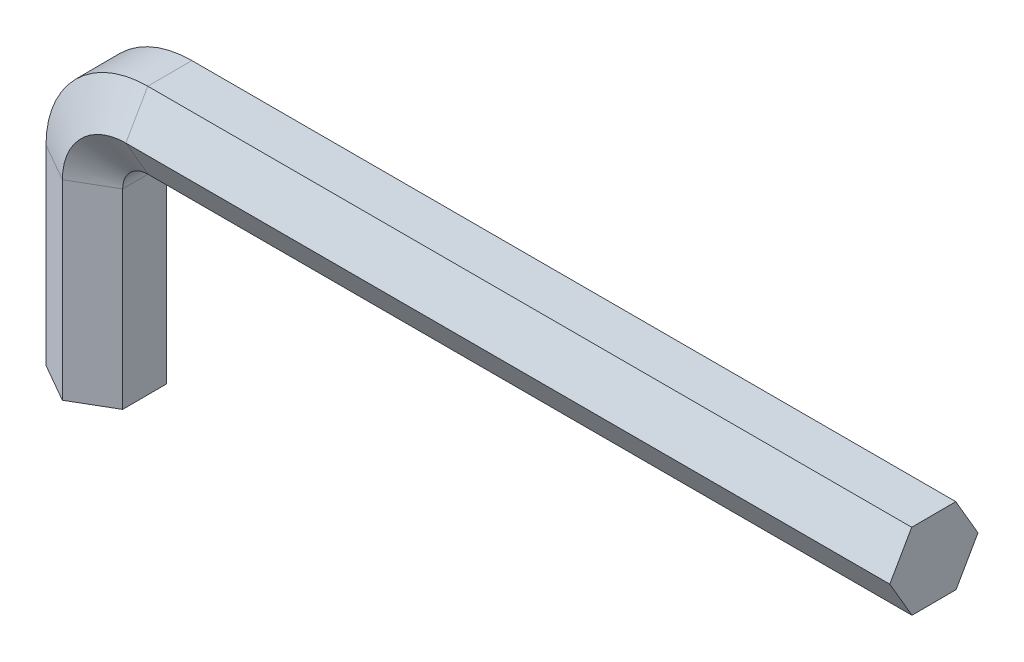
ISO-10303-21;
HEADER;
FILE_DESCRIPTION(('STEP AP214'),'2;1');
FILE_NAME('part.step','',(''),(''),'','','');
FILE_SCHEMA(('AUTOMOTIVE_DESIGN { 1 0 10303 214 1 1 1 1 }'));
ENDSEC;
DATA;
#1=APPLICATION_CONTEXT('core data for automotive mechanical design processes');
#2=APPLICATION_PROTOCOL_DEFINITION('international standard','automotive_design',2000,#1);
#3=PRODUCT_CONTEXT('',#1,'mechanical');
#4=PRODUCT('Part','Part','',(#3));
#5=PRODUCT_RELATED_PRODUCT_CATEGORY('part','',(#4));
#6=PRODUCT_DEFINITION_FORMATION('','',#4);
#7=PRODUCT_DEFINITION_CONTEXT('part definition',#1,'design');
#8=PRODUCT_DEFINITION('design','',#6,#7);
#9=PRODUCT_DEFINITION_SHAPE('','',#8);
#10=(LENGTH_UNIT() NAMED_UNIT(*) SI_UNIT(.MILLI.,.METRE.));
#11=(NAMED_UNIT(*) PLANE_ANGLE_UNIT() SI_UNIT($,.RADIAN.));
#12=(NAMED_UNIT(*) SI_UNIT($,.STERADIAN.) SOLID_ANGLE_UNIT());
#13=UNCERTAINTY_MEASURE_WITH_UNIT(LENGTH_MEASURE(1.E-05),#10,'distance_accuracy_value','');
#14=(GEOMETRIC_REPRESENTATION_CONTEXT(3) GLOBAL_UNCERTAINTY_ASSIGNED_CONTEXT((#13)) GLOBAL_UNIT_ASSIGNED_CONTEXT((#10,
#11,#12)) REPRESENTATION_CONTEXT('',''));
#15=CARTESIAN_POINT('',(0.,0.,0.));
#16=DIRECTION('',(0.,0.,1.));
#17=DIRECTION('',(1.,0.,0.));
#18=AXIS2_PLACEMENT_3D('',#15,#16,#17);
#19=CARTESIAN_POINT('',(0.,0.,0.));
#20=DIRECTION('',(-1.,0.,0.));
#21=DIRECTION('',(0.,-1.,0.));
#22=AXIS2_PLACEMENT_3D('',#19,#20,#21);
#23=PLANE('',#22);
#24=DIRECTION('',(0.,-0.00375398085830022,0.999992953789033));
#25=VECTOR('',#24,1.);
#26=CARTESIAN_POINT('',(0.,-2.99347677578988,-1.74330054574838));
#27=LINE('',#26,#25);
#28=CARTESIAN_POINT('',(0.,-2.99347677578988,-1.74330054574838));
#29=VERTEX_POINT('',#28);
#30=CARTESIAN_POINT('',(0.,-3.00648094694432,1.72077666059858));
#31=VERTEX_POINT('',#30);
#32=EDGE_CURVE('E187',#29,#31,#27,.T.);
#33=ORIENTED_EDGE('',*,*,#32,.F.);
#34=DIRECTION('',(0.,-0.867896292015891,0.496745434105908));
#35=VECTOR('',#34,1.);
#36=CARTESIAN_POINT('',(0.,0.0130041711544332,-3.46407720634696));
#37=LINE('',#36,#35);
#38=CARTESIAN_POINT('',(0.,0.0130041711544332,-3.46407720634696));
#39=VERTEX_POINT('',#38);
#40=EDGE_CURVE('E229',#39,#29,#37,.T.);
#41=ORIENTED_EDGE('',*,*,#40,.F.);
#42=DIRECTION('',(0.,-0.864142311157591,-0.503247519683125));
#43=VECTOR('',#42,1.);
#44=CARTESIAN_POINT('',(0.,3.00648094694432,-1.72077666059858));
#45=LINE('',#44,#43);
#46=CARTESIAN_POINT('',(0.,3.00648094694432,-1.72077666059858));
#47=VERTEX_POINT('',#46);
#48=EDGE_CURVE('E216',#47,#39,#45,.T.);
#49=ORIENTED_EDGE('',*,*,#48,.F.);
#50=DIRECTION('',(0.,0.00375398085829997,-0.999992953789033));
#51=VECTOR('',#50,1.);
#52=CARTESIAN_POINT('',(0.,2.99347677578988,1.74330054574838));
#53=LINE('',#52,#51);
#54=CARTESIAN_POINT('',(0.,2.99347677578988,1.74330054574838));
#55=VERTEX_POINT('',#54);
#56=EDGE_CURVE('E139',#55,#47,#53,.T.);
#57=ORIENTED_EDGE('',*,*,#56,.F.);
#58=DIRECTION('',(0.,0.867896292015891,-0.496745434105908));
#59=VECTOR('',#58,1.);
#60=CARTESIAN_POINT('',(0.,-0.0130041711544324,3.46407720634696));
#61=LINE('',#60,#59);
#62=CARTESIAN_POINT('',(0.,-0.0130041711544324,3.46407720634696));
#63=VERTEX_POINT('',#62);
#64=EDGE_CURVE('E143',#63,#55,#61,.T.);
#65=ORIENTED_EDGE('',*,*,#64,.F.);
#66=DIRECTION('',(0.,0.864142311157591,0.503247519683125));
#67=VECTOR('',#66,1.);
#68=CARTESIAN_POINT('',(0.,-3.00648094694432,1.72077666059858));
#69=LINE('',#68,#67);
#70=EDGE_CURVE('E148',#31,#63,#69,.T.);
#71=ORIENTED_EDGE('',*,*,#70,.F.);
#72=EDGE_LOOP('',(#33,#41,#49,#57,#65,#71));
#73=FACE_BOUND('',#72,.T.);
#74=ADVANCED_FACE('F38',(#73),#23,.F.);
#75=CARTESIAN_POINT('',(-65.,-20.,0.));
#76=DIRECTION('',(0.,-1.,0.));
#77=DIRECTION('',(1.,0.,0.));
#78=AXIS2_PLACEMENT_3D('',#75,#76,#77);
#79=PLANE('',#78);
#80=DIRECTION('',(0.00375398085830022,0.,0.999992953789033));
#81=VECTOR('',#80,1.);
#82=CARTESIAN_POINT('',(-62.0065232242101,-20.,-1.74330054574838));
#83=LINE('',#82,#81);
#84=CARTESIAN_POINT('',(-62.0065232242101,-20.,-1.74330054574838));
#85=VERTEX_POINT('',#84);
#86=CARTESIAN_POINT('',(-61.9935190530557,-20.,1.72077666059858));
#87=VERTEX_POINT('',#86);
#88=EDGE_CURVE('E159',#85,#87,#83,.T.);
#89=ORIENTED_EDGE('',*,*,#88,.T.);
#90=DIRECTION('',(-0.864142311157591,0.,0.503247519683125));
#91=VECTOR('',#90,1.);
#92=CARTESIAN_POINT('',(-61.9935190530557,-20.,1.72077666059858));
#93=LINE('',#92,#91);
#94=CARTESIAN_POINT('',(-64.9869958288456,-20.,3.46407720634696));
#95=VERTEX_POINT('',#94);
#96=EDGE_CURVE('E162',#87,#95,#93,.T.);
#97=ORIENTED_EDGE('',*,*,#96,.T.);
#98=DIRECTION('',(-0.867896292015891,0.,-0.496745434105908));
#99=VECTOR('',#98,1.);
#100=CARTESIAN_POINT('',(-64.9869958288456,-20.,3.46407720634696));
#101=LINE('',#100,#99);
#102=CARTESIAN_POINT('',(-67.9934767757899,-20.,1.74330054574838));
#103=VERTEX_POINT('',#102);
#104=EDGE_CURVE('E202',#95,#103,#101,.T.);
#105=ORIENTED_EDGE('',*,*,#104,.T.);
#106=DIRECTION('',(-0.00375398085829997,0.,-0.999992953789033));
#107=VECTOR('',#106,1.);
#108=CARTESIAN_POINT('',(-67.9934767757899,-20.,1.74330054574838));
#109=LINE('',#108,#107);
#110=CARTESIAN_POINT('',(-68.0064809469443,-20.,-1.72077666059858));
#111=VERTEX_POINT('',#110);
#112=EDGE_CURVE('E57',#103,#111,#109,.T.);
#113=ORIENTED_EDGE('',*,*,#112,.T.);
#114=DIRECTION('',(0.864142311157591,0.,-0.503247519683125));
#115=VECTOR('',#114,1.);
#116=CARTESIAN_POINT('',(-68.0064809469443,-20.,-1.72077666059858));
#117=LINE('',#116,#115);
#118=CARTESIAN_POINT('',(-65.0130041711544,-20.,-3.46407720634696));
#119=VERTEX_POINT('',#118);
#120=EDGE_CURVE('E51',#111,#119,#117,.T.);
#121=ORIENTED_EDGE('',*,*,#120,.T.);
#122=DIRECTION('',(0.867896292015891,0.,0.496745434105908));
#123=VECTOR('',#122,1.);
#124=CARTESIAN_POINT('',(-65.0130041711544,-20.,-3.46407720634696));
#125=LINE('',#124,#123);
#126=EDGE_CURVE('E11',#119,#85,#125,.T.);
#127=ORIENTED_EDGE('',*,*,#126,.T.);
#128=EDGE_LOOP('',(#89,#97,#105,#113,#121,#127));
#129=FACE_BOUND('',#128,.T.);
#130=ADVANCED_FACE('F161',(#129),#79,.T.);
#131=CARTESIAN_POINT('',(0.,-2.99347677578988,-1.74330054574838));
#132=DIRECTION('',(0.,-0.999992953789033,-0.00375398085830022));
#133=DIRECTION('',(0.,0.00375398085830022,-0.999992953789033));
#134=AXIS2_PLACEMENT_3D('',#131,#132,#133);
#135=PLANE('',#134);
#136=DIRECTION('',(-1.,0.,0.));
#137=VECTOR('',#136,1.);
#138=CARTESIAN_POINT('',(0.,-3.00648094694432,1.72077666059858));
#139=LINE('',#138,#137);
#140=CARTESIAN_POINT('',(-60.,-3.00648094694432,1.72077666059858));
#141=VERTEX_POINT('',#140);
#142=EDGE_CURVE('E192',#31,#141,#139,.T.);
#143=ORIENTED_EDGE('',*,*,#142,.T.);
#144=DIRECTION('',(0.,-0.00375398085830022,0.999992953789033));
#145=VECTOR('',#144,1.);
#146=CARTESIAN_POINT('',(-60.,-2.99347677578989,-1.74330054574838));
#147=LINE('',#146,#145);
#148=CARTESIAN_POINT('',(-60.,-2.99347677578989,-1.74330054574838));
#149=VERTEX_POINT('',#148);
#150=EDGE_CURVE('E261',#149,#141,#147,.T.);
#151=ORIENTED_EDGE('',*,*,#150,.F.);
#152=DIRECTION('',(-1.,0.,0.));
#153=VECTOR('',#152,1.);
#154=CARTESIAN_POINT('',(0.,-2.99347677578988,-1.74330054574838));
#155=LINE('',#154,#153);
#156=EDGE_CURVE('E243',#29,#149,#155,.T.);
#157=ORIENTED_EDGE('',*,*,#156,.F.);
#158=ORIENTED_EDGE('',*,*,#32,.T.);
#159=EDGE_LOOP('',(#143,#151,#157,#158));
#160=FACE_BOUND('',#159,.T.);
#161=ADVANCED_FACE('F268',(#160),#135,.T.);
#162=CARTESIAN_POINT('',(0.,-3.00648094694432,1.72077666059858));
#163=DIRECTION('',(0.,-0.503247519683125,0.864142311157591));
#164=DIRECTION('',(0.,-0.864142311157591,-0.503247519683125));
#165=AXIS2_PLACEMENT_3D('',#162,#163,#164);
#166=PLANE('',#165);
#167=DIRECTION('',(-1.,0.,0.));
#168=VECTOR('',#167,1.);
#169=CARTESIAN_POINT('',(0.,-0.0130041711544324,3.46407720634696));
#170=LINE('',#169,#168);
#171=CARTESIAN_POINT('',(-60.,-0.0130041711544398,3.46407720634696));
#172=VERTEX_POINT('',#171);
#173=EDGE_CURVE('E191',#63,#172,#170,.T.);
#174=ORIENTED_EDGE('',*,*,#173,.T.);
#175=DIRECTION('',(0.,0.864142311157591,0.503247519683125));
#176=VECTOR('',#175,1.);
#177=CARTESIAN_POINT('',(-60.,-3.00648094694432,1.72077666059858));
#178=LINE('',#177,#176);
#179=EDGE_CURVE('E188',#141,#172,#178,.T.);
#180=ORIENTED_EDGE('',*,*,#179,.F.);
#181=ORIENTED_EDGE('',*,*,#142,.F.);
#182=ORIENTED_EDGE('',*,*,#70,.T.);
#183=EDGE_LOOP('',(#174,#180,#181,#182));
#184=FACE_BOUND('',#183,.T.);
#185=ADVANCED_FACE('F271',(#184),#166,.T.);
#186=CARTESIAN_POINT('',(0.,-0.0130041711544324,3.46407720634696));
#187=DIRECTION('',(0.,0.496745434105908,0.867896292015891));
#188=DIRECTION('',(0.,-0.867896292015891,0.496745434105908));
#189=AXIS2_PLACEMENT_3D('',#186,#187,#188);
#190=PLANE('',#189);
#191=DIRECTION('',(-1.,0.,0.));
#192=VECTOR('',#191,1.);
#193=CARTESIAN_POINT('',(0.,2.99347677578988,1.74330054574838));
#194=LINE('',#193,#192);
#195=CARTESIAN_POINT('',(-60.,2.99347677578988,1.74330054574838));
#196=VERTEX_POINT('',#195);
#197=EDGE_CURVE('E205',#55,#196,#194,.T.);
#198=ORIENTED_EDGE('',*,*,#197,.T.);
#199=DIRECTION('',(0.,0.867896292015891,-0.496745434105908));
#200=VECTOR('',#199,1.);
#201=CARTESIAN_POINT('',(-60.,-0.0130041711544398,3.46407720634696));
#202=LINE('',#201,#200);
#203=EDGE_CURVE('E195',#172,#196,#202,.T.);
#204=ORIENTED_EDGE('',*,*,#203,.F.);
#205=ORIENTED_EDGE('',*,*,#173,.F.);
#206=ORIENTED_EDGE('',*,*,#64,.T.);
#207=EDGE_LOOP('',(#198,#204,#205,#206));
#208=FACE_BOUND('',#207,.T.);
#209=ADVANCED_FACE('F328',(#208),#190,.T.);
#210=CARTESIAN_POINT('',(0.,2.99347677578988,1.74330054574838));
#211=DIRECTION('',(0.,0.999992953789033,0.00375398085829997));
#212=DIRECTION('',(0.,-0.00375398085829997,0.999992953789033));
#213=AXIS2_PLACEMENT_3D('',#210,#211,#212);
#214=PLANE('',#213);
#215=DIRECTION('',(-1.,0.,0.));
#216=VECTOR('',#215,1.);
#217=CARTESIAN_POINT('',(0.,3.00648094694432,-1.72077666059858));
#218=LINE('',#217,#216);
#219=CARTESIAN_POINT('',(-60.,3.00648094694431,-1.72077666059858));
#220=VERTEX_POINT('',#219);
#221=EDGE_CURVE('E218',#47,#220,#218,.T.);
#222=ORIENTED_EDGE('',*,*,#221,.T.);
#223=DIRECTION('',(0.,0.00375398085829997,-0.999992953789033));
#224=VECTOR('',#223,1.);
#225=CARTESIAN_POINT('',(-60.,2.99347677578988,1.74330054574838));
#226=LINE('',#225,#224);
#227=EDGE_CURVE('E208',#196,#220,#226,.T.);
#228=ORIENTED_EDGE('',*,*,#227,.F.);
#229=ORIENTED_EDGE('',*,*,#197,.F.);
#230=ORIENTED_EDGE('',*,*,#56,.T.);
#231=EDGE_LOOP('',(#222,#228,#229,#230));
#232=FACE_BOUND('',#231,.T.);
#233=ADVANCED_FACE('F337',(#232),#214,.T.);
#234=CARTESIAN_POINT('',(0.,3.00648094694432,-1.72077666059858));
#235=DIRECTION('',(0.,0.503247519683125,-0.864142311157591));
#236=DIRECTION('',(0.,0.864142311157591,0.503247519683125));
#237=AXIS2_PLACEMENT_3D('',#234,#235,#236);
#238=PLANE('',#237);
#239=DIRECTION('',(-1.,0.,0.));
#240=VECTOR('',#239,1.);
#241=CARTESIAN_POINT('',(0.,0.0130041711544332,-3.46407720634696));
#242=LINE('',#241,#240);
#243=CARTESIAN_POINT('',(-60.,0.0130041711544258,-3.46407720634696));
#244=VERTEX_POINT('',#243);
#245=EDGE_CURVE('E231',#39,#244,#242,.T.);
#246=ORIENTED_EDGE('',*,*,#245,.T.);
#247=DIRECTION('',(0.,-0.864142311157591,-0.503247519683125));
#248=VECTOR('',#247,1.);
#249=CARTESIAN_POINT('',(-60.,3.00648094694431,-1.72077666059858));
#250=LINE('',#249,#248);
#251=EDGE_CURVE('E221',#220,#244,#250,.T.);
#252=ORIENTED_EDGE('',*,*,#251,.F.);
#253=ORIENTED_EDGE('',*,*,#221,.F.);
#254=ORIENTED_EDGE('',*,*,#48,.T.);
#255=EDGE_LOOP('',(#246,#252,#253,#254));
#256=FACE_BOUND('',#255,.T.);
#257=ADVANCED_FACE('F348',(#256),#238,.T.);
#258=CARTESIAN_POINT('',(0.,0.0130041711544332,-3.46407720634696));
#259=DIRECTION('',(0.,-0.496745434105908,-0.867896292015891));
#260=DIRECTION('',(0.,0.867896292015891,-0.496745434105908));
#261=AXIS2_PLACEMENT_3D('',#258,#259,#260);
#262=PLANE('',#261);
#263=DIRECTION('',(0.,-0.867896292015891,0.496745434105908));
#264=VECTOR('',#263,1.);
#265=CARTESIAN_POINT('',(-60.,0.0130041711544258,-3.46407720634696));
#266=LINE('',#265,#264);
#267=EDGE_CURVE('E234',#244,#149,#266,.T.);
#268=ORIENTED_EDGE('',*,*,#267,.F.);
#269=ORIENTED_EDGE('',*,*,#245,.F.);
#270=ORIENTED_EDGE('',*,*,#40,.T.);
#271=ORIENTED_EDGE('',*,*,#156,.T.);
#272=EDGE_LOOP('',(#268,#269,#270,#271));
#273=FACE_BOUND('',#272,.T.);
#274=ADVANCED_FACE('F284',(#273),#262,.T.);
#275=CARTESIAN_POINT('',(-60.,-5.00000000000001,-1.74330054574838));
#276=DIRECTION('',(0.,0.,-1.));
#277=DIRECTION('',(-1.,0.,0.));
#278=AXIS2_PLACEMENT_3D('',#275,#276,#277);
#279=CONICAL_SURFACE('',#278,2.00652322421012,0.00375398967543877);
#280=CARTESIAN_POINT('',(-60.,-5.00000000000001,1.72077666059858));
#281=DIRECTION('',(0.,0.,1.));
#282=DIRECTION('',(0.,1.,0.));
#283=AXIS2_PLACEMENT_3D('',#280,#281,#282);
#284=CIRCLE('',#283,1.99351905305568);
#285=CARTESIAN_POINT('',(-61.9935190530557,-5.00000000000002,1.72077666059858));
#286=VERTEX_POINT('',#285);
#287=EDGE_CURVE('E198',#141,#286,#284,.T.);
#288=ORIENTED_EDGE('',*,*,#287,.T.);
#289=DIRECTION('',(0.00375398085830022,0.,0.999992953789033));
#290=VECTOR('',#289,1.);
#291=CARTESIAN_POINT('',(-62.0065232242101,-5.00000000000002,-1.74330054574838));
#292=LINE('',#291,#290);
#293=CARTESIAN_POINT('',(-62.0065232242101,-5.00000000000002,-1.74330054574838));
#294=VERTEX_POINT('',#293);
#295=EDGE_CURVE('E180',#294,#286,#292,.T.);
#296=ORIENTED_EDGE('',*,*,#295,.F.);
#297=CARTESIAN_POINT('',(-60.,-5.00000000000001,-1.74330054574838));
#298=DIRECTION('',(0.,0.,1.));
#299=DIRECTION('',(0.,1.,0.));
#300=AXIS2_PLACEMENT_3D('',#297,#298,#299);
#301=CIRCLE('',#300,2.00652322421012);
#302=EDGE_CURVE('E245',#149,#294,#301,.T.);
#303=ORIENTED_EDGE('',*,*,#302,.F.);
#304=ORIENTED_EDGE('',*,*,#150,.T.);
#305=EDGE_LOOP('',(#288,#296,#303,#304));
#306=FACE_BOUND('',#305,.T.);
#307=ADVANCED_FACE('F251',(#306),#279,.F.);
#308=CARTESIAN_POINT('',(-60.,-5.00000000000001,1.72077666059858));
#309=DIRECTION('',(0.,0.,1.));
#310=DIRECTION('',(1.,0.,0.));
#311=AXIS2_PLACEMENT_3D('',#308,#309,#310);
#312=CONICAL_SURFACE('',#311,1.99351905305568,1.04344356152116);
#313=CARTESIAN_POINT('',(-60.,-5.00000000000001,3.46407720634696));
#314=DIRECTION('',(0.,0.,1.));
#315=DIRECTION('',(0.,1.,0.));
#316=AXIS2_PLACEMENT_3D('',#313,#314,#315);
#317=CIRCLE('',#316,4.98699582884557);
#318=CARTESIAN_POINT('',(-64.9869958288456,-5.00000000000004,3.46407720634696));
#319=VERTEX_POINT('',#318);
#320=EDGE_CURVE('E126',#172,#319,#317,.T.);
#321=ORIENTED_EDGE('',*,*,#320,.T.);
#322=DIRECTION('',(-0.864142311157591,0.,0.503247519683125));
#323=VECTOR('',#322,1.);
#324=CARTESIAN_POINT('',(-61.9935190530557,-5.00000000000002,1.72077666059858));
#325=LINE('',#324,#323);
#326=EDGE_CURVE('E196',#286,#319,#325,.T.);
#327=ORIENTED_EDGE('',*,*,#326,.F.);
#328=ORIENTED_EDGE('',*,*,#287,.F.);
#329=ORIENTED_EDGE('',*,*,#179,.T.);
#330=EDGE_LOOP('',(#321,#327,#328,#329));
#331=FACE_BOUND('',#330,.T.);
#332=ADVANCED_FACE('F274',(#331),#312,.F.);
#333=CARTESIAN_POINT('',(-60.,-5.00000000000001,3.46407720634696));
#334=DIRECTION('',(0.,0.,-1.));
#335=DIRECTION('',(-1.,0.,0.));
#336=AXIS2_PLACEMENT_3D('',#333,#334,#335);
#337=CONICAL_SURFACE('',#336,4.98699582884557,1.05095154087204);
#338=CARTESIAN_POINT('',(-60.,-5.00000000000001,1.74330054574838));
#339=DIRECTION('',(0.,0.,1.));
#340=DIRECTION('',(0.,1.,0.));
#341=AXIS2_PLACEMENT_3D('',#338,#339,#340);
#342=CIRCLE('',#341,7.99347677578988);
#343=CARTESIAN_POINT('',(-67.9934767757899,-5.00000000000006,1.74330054574838));
#344=VERTEX_POINT('',#343);
#345=EDGE_CURVE('E117',#196,#344,#342,.T.);
#346=ORIENTED_EDGE('',*,*,#345,.T.);
#347=DIRECTION('',(-0.867896292015891,0.,-0.496745434105908));
#348=VECTOR('',#347,1.);
#349=CARTESIAN_POINT('',(-64.9869958288456,-5.00000000000004,3.46407720634696));
#350=LINE('',#349,#348);
#351=EDGE_CURVE('E199',#319,#344,#350,.T.);
#352=ORIENTED_EDGE('',*,*,#351,.F.);
#353=ORIENTED_EDGE('',*,*,#320,.F.);
#354=ORIENTED_EDGE('',*,*,#203,.T.);
#355=EDGE_LOOP('',(#346,#352,#353,#354));
#356=FACE_BOUND('',#355,.T.);
#357=ADVANCED_FACE('F276',(#356),#337,.T.);
#358=CARTESIAN_POINT('',(-60.,-5.00000000000001,1.74330054574838));
#359=DIRECTION('',(0.,0.,-1.));
#360=DIRECTION('',(-1.,0.,0.));
#361=AXIS2_PLACEMENT_3D('',#358,#359,#360);
#362=CONICAL_SURFACE('',#361,7.99347677578988,0.00375398967543801);
#363=CARTESIAN_POINT('',(-60.,-5.00000000000001,-1.72077666059858));
#364=DIRECTION('',(0.,0.,1.));
#365=DIRECTION('',(0.,1.,0.));
#366=AXIS2_PLACEMENT_3D('',#363,#364,#365);
#367=CIRCLE('',#366,8.00648094694431);
#368=CARTESIAN_POINT('',(-68.0064809469443,-5.00000000000006,-1.72077666059858));
#369=VERTEX_POINT('',#368);
#370=EDGE_CURVE('E110',#220,#369,#367,.T.);
#371=ORIENTED_EDGE('',*,*,#370,.T.);
#372=DIRECTION('',(-0.00375398085829997,0.,-0.999992953789033));
#373=VECTOR('',#372,1.);
#374=CARTESIAN_POINT('',(-67.9934767757899,-5.00000000000006,1.74330054574838));
#375=LINE('',#374,#373);
#376=EDGE_CURVE('E212',#344,#369,#375,.T.);
#377=ORIENTED_EDGE('',*,*,#376,.F.);
#378=ORIENTED_EDGE('',*,*,#345,.F.);
#379=ORIENTED_EDGE('',*,*,#227,.T.);
#380=EDGE_LOOP('',(#371,#377,#378,#379));
#381=FACE_BOUND('',#380,.T.);
#382=ADVANCED_FACE('F282',(#381),#362,.T.);
#383=CARTESIAN_POINT('',(-60.,-5.00000000000001,-1.72077666059858));
#384=DIRECTION('',(0.,0.,1.));
#385=DIRECTION('',(1.,0.,0.));
#386=AXIS2_PLACEMENT_3D('',#383,#384,#385);
#387=CONICAL_SURFACE('',#386,8.00648094694431,1.04344356152116);
#388=CARTESIAN_POINT('',(-60.,-5.00000000000001,-3.46407720634696));
#389=DIRECTION('',(0.,0.,1.));
#390=DIRECTION('',(0.,1.,0.));
#391=AXIS2_PLACEMENT_3D('',#388,#389,#390);
#392=CIRCLE('',#391,5.01300417115443);
#393=CARTESIAN_POINT('',(-65.0130041711544,-5.00000000000004,-3.46407720634696));
#394=VERTEX_POINT('',#393);
#395=EDGE_CURVE('E236',#244,#394,#392,.T.);
#396=ORIENTED_EDGE('',*,*,#395,.T.);
#397=DIRECTION('',(0.864142311157591,0.,-0.503247519683125));
#398=VECTOR('',#397,1.);
#399=CARTESIAN_POINT('',(-68.0064809469443,-5.00000000000006,-1.72077666059858));
#400=LINE('',#399,#398);
#401=EDGE_CURVE('E224',#369,#394,#400,.T.);
#402=ORIENTED_EDGE('',*,*,#401,.F.);
#403=ORIENTED_EDGE('',*,*,#370,.F.);
#404=ORIENTED_EDGE('',*,*,#251,.T.);
#405=EDGE_LOOP('',(#396,#402,#403,#404));
#406=FACE_BOUND('',#405,.T.);
#407=ADVANCED_FACE('F397',(#406),#387,.T.);
#408=CARTESIAN_POINT('',(-60.,-5.00000000000001,-3.46407720634696));
#409=DIRECTION('',(0.,0.,-1.));
#410=DIRECTION('',(-1.,0.,0.));
#411=AXIS2_PLACEMENT_3D('',#408,#409,#410);
#412=CONICAL_SURFACE('',#411,5.01300417115443,1.05095154087204);
#413=DIRECTION('',(0.867896292015891,0.,0.496745434105908));
#414=VECTOR('',#413,1.);
#415=CARTESIAN_POINT('',(-65.0130041711544,-5.00000000000004,-3.46407720634696));
#416=LINE('',#415,#414);
#417=EDGE_CURVE('E185',#394,#294,#416,.T.);
#418=ORIENTED_EDGE('',*,*,#417,.F.);
#419=ORIENTED_EDGE('',*,*,#395,.F.);
#420=ORIENTED_EDGE('',*,*,#267,.T.);
#421=ORIENTED_EDGE('',*,*,#302,.T.);
#422=EDGE_LOOP('',(#418,#419,#420,#421));
#423=FACE_BOUND('',#422,.T.);
#424=ADVANCED_FACE('F254',(#423),#412,.F.);
#425=CARTESIAN_POINT('',(-62.0065232242101,-5.00000000000004,-1.74330054574838));
#426=DIRECTION('',(0.999992953789033,0.,-0.00375398085830022));
#427=DIRECTION('',(-0.00375398085830022,0.,-0.999992953789033));
#428=AXIS2_PLACEMENT_3D('',#425,#426,#427);
#429=PLANE('',#428);
#430=DIRECTION('',(0.,-1.,0.));
#431=VECTOR('',#430,1.);
#432=CARTESIAN_POINT('',(-61.9935190530557,-5.00000000000004,1.72077666059858));
#433=LINE('',#432,#431);
#434=EDGE_CURVE('E167',#286,#87,#433,.T.);
#435=ORIENTED_EDGE('',*,*,#434,.T.);
#436=ORIENTED_EDGE('',*,*,#88,.F.);
#437=DIRECTION('',(0.,-1.,0.));
#438=VECTOR('',#437,1.);
#439=CARTESIAN_POINT('',(-62.0065232242101,-5.00000000000004,-1.74330054574838));
#440=LINE('',#439,#438);
#441=EDGE_CURVE('E168',#294,#85,#440,.T.);
#442=ORIENTED_EDGE('',*,*,#441,.F.);
#443=ORIENTED_EDGE('',*,*,#295,.T.);
#444=EDGE_LOOP('',(#435,#436,#442,#443));
#445=FACE_BOUND('',#444,.T.);
#446=ADVANCED_FACE('F178',(#445),#429,.T.);
#447=CARTESIAN_POINT('',(-61.9935190530557,-5.00000000000004,1.72077666059858));
#448=DIRECTION('',(0.503247519683125,0.,0.864142311157591));
#449=DIRECTION('',(0.864142311157591,0.,-0.503247519683125));
#450=AXIS2_PLACEMENT_3D('',#447,#448,#449);
#451=PLANE('',#450);
#452=DIRECTION('',(0.,-1.,0.));
#453=VECTOR('',#452,1.);
#454=CARTESIAN_POINT('',(-64.9869958288456,-5.00000000000004,3.46407720634696));
#455=LINE('',#454,#453);
#456=EDGE_CURVE('E175',#319,#95,#455,.T.);
#457=ORIENTED_EDGE('',*,*,#456,.T.);
#458=ORIENTED_EDGE('',*,*,#96,.F.);
#459=ORIENTED_EDGE('',*,*,#434,.F.);
#460=ORIENTED_EDGE('',*,*,#326,.T.);
#461=EDGE_LOOP('',(#457,#458,#459,#460));
#462=FACE_BOUND('',#461,.T.);
#463=ADVANCED_FACE('F172',(#462),#451,.T.);
#464=CARTESIAN_POINT('',(-64.9869958288456,-5.00000000000004,3.46407720634696));
#465=DIRECTION('',(-0.496745434105908,0.,0.867896292015891));
#466=DIRECTION('',(0.867896292015891,0.,0.496745434105908));
#467=AXIS2_PLACEMENT_3D('',#464,#465,#466);
#468=PLANE('',#467);
#469=DIRECTION('',(0.,-1.,0.));
#470=VECTOR('',#469,1.);
#471=CARTESIAN_POINT('',(-67.9934767757899,-5.00000000000004,1.74330054574838));
#472=LINE('',#471,#470);
#473=EDGE_CURVE('E95',#344,#103,#472,.T.);
#474=ORIENTED_EDGE('',*,*,#473,.T.);
#475=ORIENTED_EDGE('',*,*,#104,.F.);
#476=ORIENTED_EDGE('',*,*,#456,.F.);
#477=ORIENTED_EDGE('',*,*,#351,.T.);
#478=EDGE_LOOP('',(#474,#475,#476,#477));
#479=FACE_BOUND('',#478,.T.);
#480=ADVANCED_FACE('F433',(#479),#468,.T.);
#481=CARTESIAN_POINT('',(-67.9934767757899,-5.00000000000004,1.74330054574838));
#482=DIRECTION('',(-0.999992953789033,0.,0.00375398085829997));
#483=DIRECTION('',(0.00375398085829997,0.,0.999992953789033));
#484=AXIS2_PLACEMENT_3D('',#481,#482,#483);
#485=PLANE('',#484);
#486=DIRECTION('',(0.,-1.,0.));
#487=VECTOR('',#486,1.);
#488=CARTESIAN_POINT('',(-68.0064809469443,-5.00000000000004,-1.72077666059858));
#489=LINE('',#488,#487);
#490=EDGE_CURVE('E87',#369,#111,#489,.T.);
#491=ORIENTED_EDGE('',*,*,#490,.T.);
#492=ORIENTED_EDGE('',*,*,#112,.F.);
#493=ORIENTED_EDGE('',*,*,#473,.F.);
#494=ORIENTED_EDGE('',*,*,#376,.T.);
#495=EDGE_LOOP('',(#491,#492,#493,#494));
#496=FACE_BOUND('',#495,.T.);
#497=ADVANCED_FACE('F294',(#496),#485,.T.);
#498=CARTESIAN_POINT('',(-68.0064809469443,-5.00000000000004,-1.72077666059858));
#499=DIRECTION('',(-0.503247519683125,0.,-0.864142311157591));
#500=DIRECTION('',(-0.864142311157591,0.,0.503247519683125));
#501=AXIS2_PLACEMENT_3D('',#498,#499,#500);
#502=PLANE('',#501);
#503=DIRECTION('',(0.,-1.,0.));
#504=VECTOR('',#503,1.);
#505=CARTESIAN_POINT('',(-65.0130041711544,-5.00000000000004,-3.46407720634696));
#506=LINE('',#505,#504);
#507=EDGE_CURVE('E45',#394,#119,#506,.T.);
#508=ORIENTED_EDGE('',*,*,#507,.T.);
#509=ORIENTED_EDGE('',*,*,#120,.F.);
#510=ORIENTED_EDGE('',*,*,#490,.F.);
#511=ORIENTED_EDGE('',*,*,#401,.T.);
#512=EDGE_LOOP('',(#508,#509,#510,#511));
#513=FACE_BOUND('',#512,.T.);
#514=ADVANCED_FACE('F289',(#513),#502,.T.);
#515=CARTESIAN_POINT('',(-65.0130041711544,-5.00000000000004,-3.46407720634696));
#516=DIRECTION('',(0.496745434105908,0.,-0.867896292015891));
#517=DIRECTION('',(-0.867896292015891,0.,-0.496745434105908));
#518=AXIS2_PLACEMENT_3D('',#515,#516,#517);
#519=PLANE('',#518);
#520=ORIENTED_EDGE('',*,*,#126,.F.);
#521=ORIENTED_EDGE('',*,*,#507,.F.);
#522=ORIENTED_EDGE('',*,*,#417,.T.);
#523=ORIENTED_EDGE('',*,*,#441,.T.);
#524=EDGE_LOOP('',(#520,#521,#522,#523));
#525=FACE_BOUND('',#524,.T.);
#526=ADVANCED_FACE('F246',(#525),#519,.T.);
#527=CLOSED_SHELL('',(#74,#130,#161,#185,#209,#233,#257,#274,#307,#332,#357,#382,#407,#424,#446,
#463,#480,#497,#514,#526));
#528=MANIFOLD_SOLID_BREP('B2',#527);
#529=ADVANCED_BREP_SHAPE_REPRESENTATION('',(#18,#528),#14);
#530=SHAPE_DEFINITION_REPRESENTATION(#9,#529);
ENDSEC;
END-ISO-10303-21;
